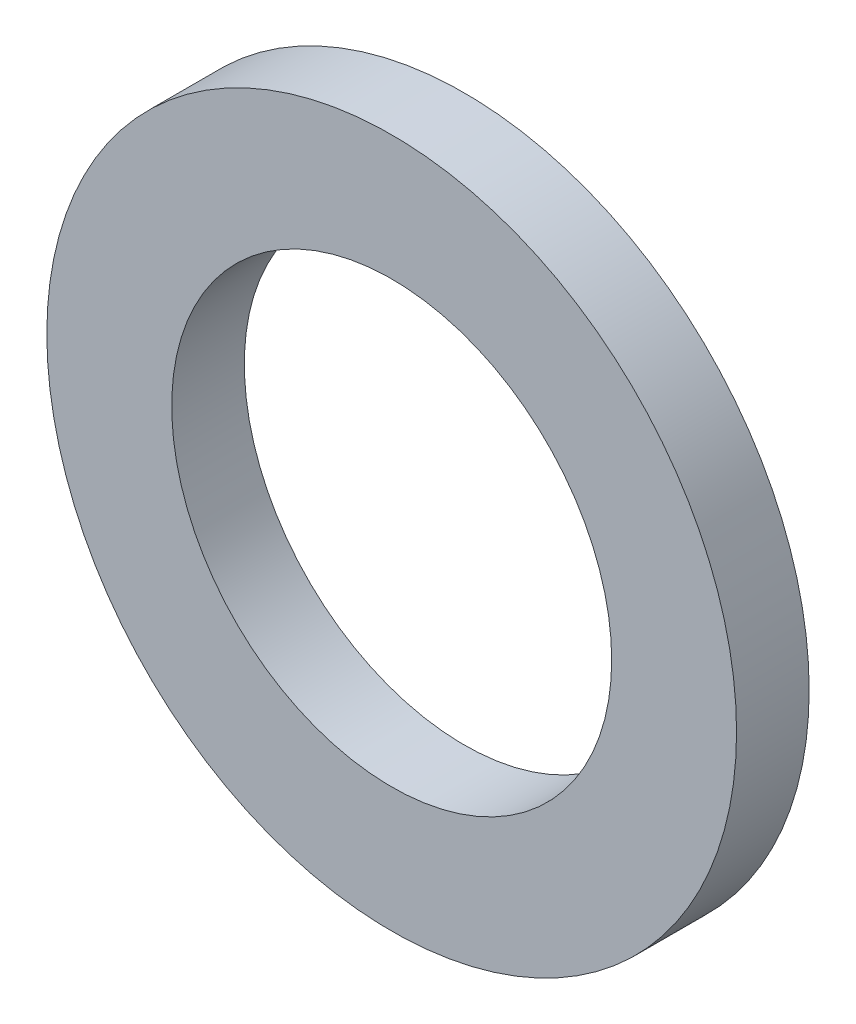
ISO-10303-21;
HEADER;
FILE_DESCRIPTION(('STEP AP214'),'2;1');
FILE_NAME('part.step','',(''),(''),'','','');
FILE_SCHEMA(('AUTOMOTIVE_DESIGN { 1 0 10303 214 1 1 1 1 }'));
ENDSEC;
DATA;
#1=APPLICATION_CONTEXT('core data for automotive mechanical design processes');
#2=APPLICATION_PROTOCOL_DEFINITION('international standard','automotive_design',2000,#1);
#3=PRODUCT_CONTEXT('',#1,'mechanical');
#4=PRODUCT('Part','Part','',(#3));
#5=PRODUCT_RELATED_PRODUCT_CATEGORY('part','',(#4));
#6=PRODUCT_DEFINITION_FORMATION('','',#4);
#7=PRODUCT_DEFINITION_CONTEXT('part definition',#1,'design');
#8=PRODUCT_DEFINITION('design','',#6,#7);
#9=PRODUCT_DEFINITION_SHAPE('','',#8);
#10=(LENGTH_UNIT() NAMED_UNIT(*) SI_UNIT(.MILLI.,.METRE.));
#11=(NAMED_UNIT(*) PLANE_ANGLE_UNIT() SI_UNIT($,.RADIAN.));
#12=(NAMED_UNIT(*) SI_UNIT($,.STERADIAN.) SOLID_ANGLE_UNIT());
#13=UNCERTAINTY_MEASURE_WITH_UNIT(LENGTH_MEASURE(1.E-05),#10,'distance_accuracy_value','');
#14=(GEOMETRIC_REPRESENTATION_CONTEXT(3) GLOBAL_UNCERTAINTY_ASSIGNED_CONTEXT((#13)) GLOBAL_UNIT_ASSIGNED_CONTEXT((#10,
#11,#12)) REPRESENTATION_CONTEXT('',''));
#15=CARTESIAN_POINT('',(0.,0.,0.));
#16=DIRECTION('',(0.,0.,1.));
#17=DIRECTION('',(1.,0.,0.));
#18=AXIS2_PLACEMENT_3D('',#15,#16,#17);
#19=CARTESIAN_POINT('',(0.,0.,1.));
#20=DIRECTION('',(0.,0.,1.));
#21=DIRECTION('',(1.,0.,0.));
#22=AXIS2_PLACEMENT_3D('',#19,#20,#21);
#23=PLANE('',#22);
#24=CARTESIAN_POINT('',(0.,0.,1.));
#25=DIRECTION('',(0.,0.,1.));
#26=DIRECTION('',(1.,0.,0.));
#27=AXIS2_PLACEMENT_3D('',#24,#25,#26);
#28=CIRCLE('',#27,4.75);
#29=CARTESIAN_POINT('',(4.75,0.,1.));
#30=VERTEX_POINT('',#29);
#31=EDGE_CURVE('E10',#30,#30,#28,.T.);
#32=ORIENTED_EDGE('',*,*,#31,.T.);
#33=EDGE_LOOP('',(#32));
#34=FACE_BOUND('',#33,.T.);
#35=CARTESIAN_POINT('',(0.,0.,1.));
#36=DIRECTION('',(0.,0.,1.));
#37=DIRECTION('',(1.,0.,0.));
#38=AXIS2_PLACEMENT_3D('',#35,#36,#37);
#39=CIRCLE('',#38,3.03);
#40=CARTESIAN_POINT('',(3.03,0.,1.));
#41=VERTEX_POINT('',#40);
#42=EDGE_CURVE('E46',#41,#41,#39,.T.);
#43=ORIENTED_EDGE('',*,*,#42,.F.);
#44=EDGE_LOOP('',(#43));
#45=FACE_BOUND('',#44,.T.);
#46=ADVANCED_FACE('F35',(#34,#45),#23,.T.);
#47=CARTESIAN_POINT('',(0.,0.,0.));
#48=DIRECTION('',(0.,0.,1.));
#49=DIRECTION('',(1.,0.,0.));
#50=AXIS2_PLACEMENT_3D('',#47,#48,#49);
#51=PLANE('',#50);
#52=CARTESIAN_POINT('',(0.,0.,0.));
#53=DIRECTION('',(0.,0.,1.));
#54=DIRECTION('',(1.,0.,0.));
#55=AXIS2_PLACEMENT_3D('',#52,#53,#54);
#56=CIRCLE('',#55,4.75);
#57=CARTESIAN_POINT('',(4.75,0.,0.));
#58=VERTEX_POINT('',#57);
#59=EDGE_CURVE('E39',#58,#58,#56,.T.);
#60=ORIENTED_EDGE('',*,*,#59,.F.);
#61=EDGE_LOOP('',(#60));
#62=FACE_BOUND('',#61,.T.);
#63=CARTESIAN_POINT('',(0.,0.,0.));
#64=DIRECTION('',(0.,0.,1.));
#65=DIRECTION('',(1.,0.,0.));
#66=AXIS2_PLACEMENT_3D('',#63,#64,#65);
#67=CIRCLE('',#66,3.03);
#68=CARTESIAN_POINT('',(3.03,0.,0.));
#69=VERTEX_POINT('',#68);
#70=EDGE_CURVE('E48',#69,#69,#67,.T.);
#71=ORIENTED_EDGE('',*,*,#70,.T.);
#72=EDGE_LOOP('',(#71));
#73=FACE_BOUND('',#72,.T.);
#74=ADVANCED_FACE('F58',(#62,#73),#51,.F.);
#75=CARTESIAN_POINT('',(0.,0.,1.));
#76=DIRECTION('',(0.,0.,-1.));
#77=DIRECTION('',(-1.,0.,0.));
#78=AXIS2_PLACEMENT_3D('',#75,#76,#77);
#79=CYLINDRICAL_SURFACE('',#78,4.75);
#80=ORIENTED_EDGE('',*,*,#31,.F.);
#81=EDGE_LOOP('',(#80));
#82=FACE_BOUND('',#81,.T.);
#83=ORIENTED_EDGE('',*,*,#59,.T.);
#84=EDGE_LOOP('',(#83));
#85=FACE_BOUND('',#84,.T.);
#86=ADVANCED_FACE('F37',(#82,#85),#79,.T.);
#87=CARTESIAN_POINT('',(0.,0.,1.));
#88=DIRECTION('',(0.,0.,-1.));
#89=DIRECTION('',(-1.,0.,0.));
#90=AXIS2_PLACEMENT_3D('',#87,#88,#89);
#91=CYLINDRICAL_SURFACE('',#90,3.03);
#92=ORIENTED_EDGE('',*,*,#42,.T.);
#93=EDGE_LOOP('',(#92));
#94=FACE_BOUND('',#93,.T.);
#95=ORIENTED_EDGE('',*,*,#70,.F.);
#96=EDGE_LOOP('',(#95));
#97=FACE_BOUND('',#96,.T.);
#98=ADVANCED_FACE('F54',(#94,#97),#91,.F.);
#99=CLOSED_SHELL('',(#46,#74,#86,#98));
#100=MANIFOLD_SOLID_BREP('B2',#99);
#101=ADVANCED_BREP_SHAPE_REPRESENTATION('',(#18,#100),#14);
#102=SHAPE_DEFINITION_REPRESENTATION(#9,#101);
ENDSEC;
END-ISO-10303-21;
